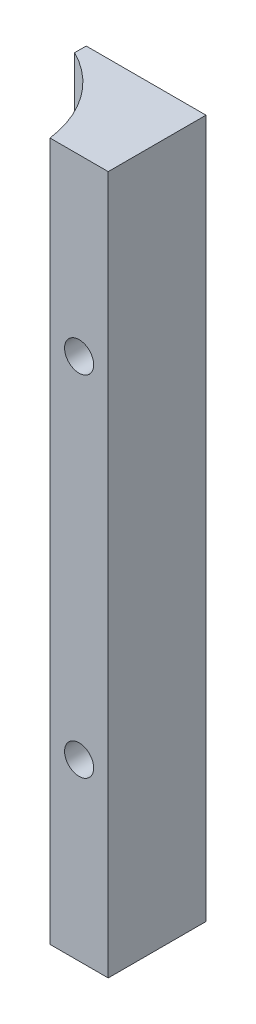
ISO-10303-21;
HEADER;
FILE_DESCRIPTION(('STEP AP214'),'2;1');
FILE_NAME('part.step','',(''),(''),'','','');
FILE_SCHEMA(('AUTOMOTIVE_DESIGN { 1 0 10303 214 1 1 1 1 }'));
ENDSEC;
DATA;
#1=APPLICATION_CONTEXT('core data for automotive mechanical design processes');
#2=APPLICATION_PROTOCOL_DEFINITION('international standard','automotive_design',2000,#1);
#3=PRODUCT_CONTEXT('',#1,'mechanical');
#4=PRODUCT('Part','Part','',(#3));
#5=PRODUCT_RELATED_PRODUCT_CATEGORY('part','',(#4));
#6=PRODUCT_DEFINITION_FORMATION('','',#4);
#7=PRODUCT_DEFINITION_CONTEXT('part definition',#1,'design');
#8=PRODUCT_DEFINITION('design','',#6,#7);
#9=PRODUCT_DEFINITION_SHAPE('','',#8);
#10=(LENGTH_UNIT() NAMED_UNIT(*) SI_UNIT(.MILLI.,.METRE.));
#11=(NAMED_UNIT(*) PLANE_ANGLE_UNIT() SI_UNIT($,.RADIAN.));
#12=(NAMED_UNIT(*) SI_UNIT($,.STERADIAN.) SOLID_ANGLE_UNIT());
#13=UNCERTAINTY_MEASURE_WITH_UNIT(LENGTH_MEASURE(1.E-05),#10,'distance_accuracy_value','');
#14=(GEOMETRIC_REPRESENTATION_CONTEXT(3) GLOBAL_UNCERTAINTY_ASSIGNED_CONTEXT((#13)) GLOBAL_UNIT_ASSIGNED_CONTEXT((#10,
#11,#12)) REPRESENTATION_CONTEXT('',''));
#15=CARTESIAN_POINT('',(0.,0.,0.));
#16=DIRECTION('',(0.,0.,1.));
#17=DIRECTION('',(1.,0.,0.));
#18=AXIS2_PLACEMENT_3D('',#15,#16,#17);
#19=CARTESIAN_POINT('',(-5.,60.,0.));
#20=DIRECTION('',(0.,0.,-1.));
#21=DIRECTION('',(-1.,0.,0.));
#22=AXIS2_PLACEMENT_3D('',#19,#20,#21);
#23=PLANE('',#22);
#24=CARTESIAN_POINT('',(-2.5,15.,0.));
#25=DIRECTION('',(0.,0.,1.));
#26=DIRECTION('',(1.,0.,0.));
#27=AXIS2_PLACEMENT_3D('',#24,#25,#26);
#28=CIRCLE('',#27,1.25);
#29=CARTESIAN_POINT('',(-1.25,15.,0.));
#30=VERTEX_POINT('',#29);
#31=EDGE_CURVE('E162',#30,#30,#28,.T.);
#32=ORIENTED_EDGE('',*,*,#31,.F.);
#33=EDGE_LOOP('',(#32));
#34=FACE_BOUND('',#33,.T.);
#35=DIRECTION('',(1.,0.,0.));
#36=VECTOR('',#35,1.);
#37=CARTESIAN_POINT('',(-5.,0.,0.));
#38=LINE('',#37,#36);
#39=CARTESIAN_POINT('',(-5.,0.,0.));
#40=VERTEX_POINT('',#39);
#41=CARTESIAN_POINT('',(0.,0.,0.));
#42=VERTEX_POINT('',#41);
#43=EDGE_CURVE('E118',#40,#42,#38,.T.);
#44=ORIENTED_EDGE('',*,*,#43,.T.);
#45=DIRECTION('',(0.,-1.,0.));
#46=VECTOR('',#45,1.);
#47=CARTESIAN_POINT('',(0.,60.,0.));
#48=LINE('',#47,#46);
#49=CARTESIAN_POINT('',(0.,60.,0.));
#50=VERTEX_POINT('',#49);
#51=EDGE_CURVE('E11',#50,#42,#48,.T.);
#52=ORIENTED_EDGE('',*,*,#51,.F.);
#53=DIRECTION('',(1.,0.,0.));
#54=VECTOR('',#53,1.);
#55=CARTESIAN_POINT('',(-5.,60.,0.));
#56=LINE('',#55,#54);
#57=CARTESIAN_POINT('',(-5.,60.,0.));
#58=VERTEX_POINT('',#57);
#59=EDGE_CURVE('E132',#58,#50,#56,.T.);
#60=ORIENTED_EDGE('',*,*,#59,.F.);
#61=DIRECTION('',(0.,-1.,0.));
#62=VECTOR('',#61,1.);
#63=CARTESIAN_POINT('',(-5.,60.,0.));
#64=LINE('',#63,#62);
#65=EDGE_CURVE('E114',#58,#40,#64,.T.);
#66=ORIENTED_EDGE('',*,*,#65,.T.);
#67=EDGE_LOOP('',(#44,#52,#60,#66));
#68=FACE_BOUND('',#67,.T.);
#69=CARTESIAN_POINT('',(-2.5,45.,0.));
#70=DIRECTION('',(0.,0.,1.));
#71=DIRECTION('',(1.,0.,0.));
#72=AXIS2_PLACEMENT_3D('',#69,#70,#71);
#73=CIRCLE('',#72,1.25);
#74=CARTESIAN_POINT('',(-1.25,45.,0.));
#75=VERTEX_POINT('',#74);
#76=EDGE_CURVE('E172',#75,#75,#73,.T.);
#77=ORIENTED_EDGE('',*,*,#76,.F.);
#78=EDGE_LOOP('',(#77));
#79=FACE_BOUND('',#78,.T.);
#80=ADVANCED_FACE('F39',(#34,#68,#79),#23,.F.);
#81=CARTESIAN_POINT('',(0.,60.,0.));
#82=DIRECTION('',(-1.,0.,0.));
#83=DIRECTION('',(0.,0.,1.));
#84=AXIS2_PLACEMENT_3D('',#81,#82,#83);
#85=PLANE('',#84);
#86=DIRECTION('',(0.,0.,-1.));
#87=VECTOR('',#86,1.);
#88=CARTESIAN_POINT('',(0.,0.,0.));
#89=LINE('',#88,#87);
#90=CARTESIAN_POINT('',(0.,0.,-8.4));
#91=VERTEX_POINT('',#90);
#92=EDGE_CURVE('E122',#42,#91,#89,.T.);
#93=ORIENTED_EDGE('',*,*,#92,.T.);
#94=DIRECTION('',(0.,-1.,0.));
#95=VECTOR('',#94,1.);
#96=CARTESIAN_POINT('',(0.,60.,-8.4));
#97=LINE('',#96,#95);
#98=CARTESIAN_POINT('',(0.,60.,-8.4));
#99=VERTEX_POINT('',#98);
#100=EDGE_CURVE('E48',#99,#91,#97,.T.);
#101=ORIENTED_EDGE('',*,*,#100,.F.);
#102=DIRECTION('',(0.,0.,-1.));
#103=VECTOR('',#102,1.);
#104=CARTESIAN_POINT('',(0.,60.,0.));
#105=LINE('',#104,#103);
#106=EDGE_CURVE('E90',#50,#99,#105,.T.);
#107=ORIENTED_EDGE('',*,*,#106,.F.);
#108=ORIENTED_EDGE('',*,*,#51,.T.);
#109=EDGE_LOOP('',(#93,#101,#107,#108));
#110=FACE_BOUND('',#109,.T.);
#111=ADVANCED_FACE('F155',(#110),#85,.F.);
#112=CARTESIAN_POINT('',(0.,60.,-8.4));
#113=DIRECTION('',(0.,0.,1.));
#114=DIRECTION('',(1.,0.,0.));
#115=AXIS2_PLACEMENT_3D('',#112,#113,#114);
#116=PLANE('',#115);
#117=CARTESIAN_POINT('',(-2.5,45.,-8.4));
#118=DIRECTION('',(0.,0.,1.));
#119=DIRECTION('',(1.,0.,0.));
#120=AXIS2_PLACEMENT_3D('',#117,#118,#119);
#121=CIRCLE('',#120,1.25);
#122=CARTESIAN_POINT('',(-1.25,45.,-8.4));
#123=VERTEX_POINT('',#122);
#124=EDGE_CURVE('E165',#123,#123,#121,.T.);
#125=ORIENTED_EDGE('',*,*,#124,.T.);
#126=EDGE_LOOP('',(#125));
#127=FACE_BOUND('',#126,.T.);
#128=CARTESIAN_POINT('',(-2.5,15.,-8.4));
#129=DIRECTION('',(0.,0.,1.));
#130=DIRECTION('',(1.,0.,0.));
#131=AXIS2_PLACEMENT_3D('',#128,#129,#130);
#132=CIRCLE('',#131,1.25);
#133=CARTESIAN_POINT('',(-1.25,15.,-8.4));
#134=VERTEX_POINT('',#133);
#135=EDGE_CURVE('E123',#134,#134,#132,.T.);
#136=ORIENTED_EDGE('',*,*,#135,.T.);
#137=EDGE_LOOP('',(#136));
#138=FACE_BOUND('',#137,.T.);
#139=DIRECTION('',(-1.,0.,0.));
#140=VECTOR('',#139,1.);
#141=CARTESIAN_POINT('',(0.,0.,-8.4));
#142=LINE('',#141,#140);
#143=CARTESIAN_POINT('',(-10.2908490438831,0.,-8.4));
#144=VERTEX_POINT('',#143);
#145=EDGE_CURVE('E106',#91,#144,#142,.T.);
#146=ORIENTED_EDGE('',*,*,#145,.T.);
#147=DIRECTION('',(0.,-1.,0.));
#148=VECTOR('',#147,1.);
#149=CARTESIAN_POINT('',(-10.2908490438831,60.,-8.4));
#150=LINE('',#149,#148);
#151=CARTESIAN_POINT('',(-10.2908490438831,60.,-8.4));
#152=VERTEX_POINT('',#151);
#153=EDGE_CURVE('E103',#152,#144,#150,.T.);
#154=ORIENTED_EDGE('',*,*,#153,.F.);
#155=DIRECTION('',(-1.,0.,0.));
#156=VECTOR('',#155,1.);
#157=CARTESIAN_POINT('',(0.,60.,-8.4));
#158=LINE('',#157,#156);
#159=EDGE_CURVE('E94',#99,#152,#158,.T.);
#160=ORIENTED_EDGE('',*,*,#159,.F.);
#161=ORIENTED_EDGE('',*,*,#100,.T.);
#162=EDGE_LOOP('',(#146,#154,#160,#161));
#163=FACE_BOUND('',#162,.T.);
#164=ADVANCED_FACE('F104',(#127,#138,#163),#116,.F.);
#165=CARTESIAN_POINT('',(-10.2908490438831,60.,-8.4));
#166=DIRECTION('',(1.,0.,0.));
#167=DIRECTION('',(0.,0.,-1.));
#168=AXIS2_PLACEMENT_3D('',#165,#166,#167);
#169=PLANE('',#168);
#170=DIRECTION('',(0.,0.,1.));
#171=VECTOR('',#170,1.);
#172=CARTESIAN_POINT('',(-10.2908490438831,0.,-8.4));
#173=LINE('',#172,#171);
#174=CARTESIAN_POINT('',(-10.2908490438831,0.,-7.4));
#175=VERTEX_POINT('',#174);
#176=EDGE_CURVE('E76',#144,#175,#173,.T.);
#177=ORIENTED_EDGE('',*,*,#176,.T.);
#178=DIRECTION('',(0.,-1.,0.));
#179=VECTOR('',#178,1.);
#180=CARTESIAN_POINT('',(-10.2908490438831,60.,-7.4));
#181=LINE('',#180,#179);
#182=CARTESIAN_POINT('',(-10.2908490438831,60.,-7.4));
#183=VERTEX_POINT('',#182);
#184=EDGE_CURVE('E108',#183,#175,#181,.T.);
#185=ORIENTED_EDGE('',*,*,#184,.F.);
#186=DIRECTION('',(0.,0.,1.));
#187=VECTOR('',#186,1.);
#188=CARTESIAN_POINT('',(-10.2908490438831,60.,-8.4));
#189=LINE('',#188,#187);
#190=EDGE_CURVE('E98',#152,#183,#189,.T.);
#191=ORIENTED_EDGE('',*,*,#190,.F.);
#192=ORIENTED_EDGE('',*,*,#153,.T.);
#193=EDGE_LOOP('',(#177,#185,#191,#192));
#194=FACE_BOUND('',#193,.T.);
#195=ADVANCED_FACE('F110',(#194),#169,.F.);
#196=CARTESIAN_POINT('',(-14.5686989711246,60.,1.25));
#197=DIRECTION('',(0.,-1.,0.));
#198=DIRECTION('',(0.,0.,-1.));
#199=AXIS2_PLACEMENT_3D('',#196,#197,#198);
#200=CYLINDRICAL_SURFACE('',#199,9.65);
#201=CARTESIAN_POINT('',(-14.5686989711246,0.,1.25));
#202=DIRECTION('',(0.,-1.,0.));
#203=DIRECTION('',(0.,0.,-1.));
#204=AXIS2_PLACEMENT_3D('',#201,#202,#203);
#205=CIRCLE('',#204,9.65);
#206=EDGE_CURVE('E82',#175,#40,#205,.T.);
#207=ORIENTED_EDGE('',*,*,#206,.T.);
#208=ORIENTED_EDGE('',*,*,#65,.F.);
#209=CARTESIAN_POINT('',(-14.5686989711246,60.,1.25));
#210=DIRECTION('',(0.,-1.,0.));
#211=DIRECTION('',(0.,0.,-1.));
#212=AXIS2_PLACEMENT_3D('',#209,#210,#211);
#213=CIRCLE('',#212,9.65);
#214=EDGE_CURVE('E56',#183,#58,#213,.T.);
#215=ORIENTED_EDGE('',*,*,#214,.F.);
#216=ORIENTED_EDGE('',*,*,#184,.T.);
#217=EDGE_LOOP('',(#207,#208,#215,#216));
#218=FACE_BOUND('',#217,.T.);
#219=ADVANCED_FACE('F144',(#218),#200,.F.);
#220=CARTESIAN_POINT('',(-14.5686989711246,60.,1.25));
#221=DIRECTION('',(0.,-1.,0.));
#222=DIRECTION('',(0.,0.,-1.));
#223=AXIS2_PLACEMENT_3D('',#220,#221,#222);
#224=PLANE('',#223);
#225=ORIENTED_EDGE('',*,*,#59,.T.);
#226=ORIENTED_EDGE('',*,*,#106,.T.);
#227=ORIENTED_EDGE('',*,*,#159,.T.);
#228=ORIENTED_EDGE('',*,*,#190,.T.);
#229=ORIENTED_EDGE('',*,*,#214,.T.);
#230=EDGE_LOOP('',(#225,#226,#227,#228,#229));
#231=FACE_BOUND('',#230,.T.);
#232=ADVANCED_FACE('F96',(#231),#224,.F.);
#233=CARTESIAN_POINT('',(-14.5686989711246,0.,1.25));
#234=DIRECTION('',(0.,-1.,0.));
#235=DIRECTION('',(0.,0.,-1.));
#236=AXIS2_PLACEMENT_3D('',#233,#234,#235);
#237=PLANE('',#236);
#238=ORIENTED_EDGE('',*,*,#43,.F.);
#239=ORIENTED_EDGE('',*,*,#206,.F.);
#240=ORIENTED_EDGE('',*,*,#176,.F.);
#241=ORIENTED_EDGE('',*,*,#145,.F.);
#242=ORIENTED_EDGE('',*,*,#92,.F.);
#243=EDGE_LOOP('',(#238,#239,#240,#241,#242));
#244=FACE_BOUND('',#243,.T.);
#245=ADVANCED_FACE('F139',(#244),#237,.T.);
#246=CARTESIAN_POINT('',(-2.5,15.,0.));
#247=DIRECTION('',(0.,0.,1.));
#248=DIRECTION('',(1.,0.,0.));
#249=AXIS2_PLACEMENT_3D('',#246,#247,#248);
#250=CYLINDRICAL_SURFACE('',#249,1.25);
#251=ORIENTED_EDGE('',*,*,#135,.F.);
#252=EDGE_LOOP('',(#251));
#253=FACE_BOUND('',#252,.T.);
#254=ORIENTED_EDGE('',*,*,#31,.T.);
#255=EDGE_LOOP('',(#254));
#256=FACE_BOUND('',#255,.T.);
#257=ADVANCED_FACE('F184',(#253,#256),#250,.F.);
#258=CARTESIAN_POINT('',(-2.5,45.,0.));
#259=DIRECTION('',(0.,0.,1.));
#260=DIRECTION('',(1.,0.,0.));
#261=AXIS2_PLACEMENT_3D('',#258,#259,#260);
#262=CYLINDRICAL_SURFACE('',#261,1.25);
#263=ORIENTED_EDGE('',*,*,#124,.F.);
#264=EDGE_LOOP('',(#263));
#265=FACE_BOUND('',#264,.T.);
#266=ORIENTED_EDGE('',*,*,#76,.T.);
#267=EDGE_LOOP('',(#266));
#268=FACE_BOUND('',#267,.T.);
#269=ADVANCED_FACE('F182',(#265,#268),#262,.F.);
#270=CLOSED_SHELL('',(#80,#111,#164,#195,#219,#232,#245,#257,#269));
#271=MANIFOLD_SOLID_BREP('B2',#270);
#272=ADVANCED_BREP_SHAPE_REPRESENTATION('',(#18,#271),#14);
#273=SHAPE_DEFINITION_REPRESENTATION(#9,#272);
ENDSEC;
END-ISO-10303-21;
